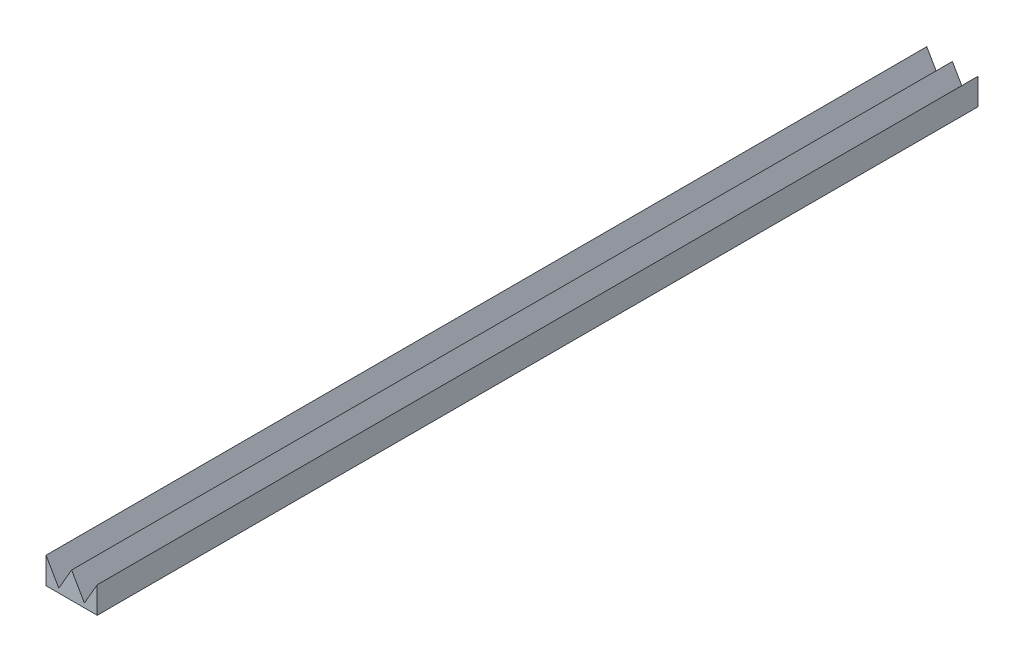
ISO-10303-21;
HEADER;
FILE_DESCRIPTION(('STEP AP214'),'2;1');
FILE_NAME('part.step','',(''),(''),'','','');
FILE_SCHEMA(('AUTOMOTIVE_DESIGN { 1 0 10303 214 1 1 1 1 }'));
ENDSEC;
DATA;
#1=APPLICATION_CONTEXT('core data for automotive mechanical design processes');
#2=APPLICATION_PROTOCOL_DEFINITION('international standard','automotive_design',2000,#1);
#3=PRODUCT_CONTEXT('',#1,'mechanical');
#4=PRODUCT('Part','Part','',(#3));
#5=PRODUCT_RELATED_PRODUCT_CATEGORY('part','',(#4));
#6=PRODUCT_DEFINITION_FORMATION('','',#4);
#7=PRODUCT_DEFINITION_CONTEXT('part definition',#1,'design');
#8=PRODUCT_DEFINITION('design','',#6,#7);
#9=PRODUCT_DEFINITION_SHAPE('','',#8);
#10=(LENGTH_UNIT() NAMED_UNIT(*) SI_UNIT(.MILLI.,.METRE.));
#11=(NAMED_UNIT(*) PLANE_ANGLE_UNIT() SI_UNIT($,.RADIAN.));
#12=(NAMED_UNIT(*) SI_UNIT($,.STERADIAN.) SOLID_ANGLE_UNIT());
#13=UNCERTAINTY_MEASURE_WITH_UNIT(LENGTH_MEASURE(1.E-05),#10,'distance_accuracy_value','');
#14=(GEOMETRIC_REPRESENTATION_CONTEXT(3) GLOBAL_UNCERTAINTY_ASSIGNED_CONTEXT((#13)) GLOBAL_UNIT_ASSIGNED_CONTEXT((#10,
#11,#12)) REPRESENTATION_CONTEXT('',''));
#15=CARTESIAN_POINT('',(0.,0.,0.));
#16=DIRECTION('',(0.,0.,1.));
#17=DIRECTION('',(1.,0.,0.));
#18=AXIS2_PLACEMENT_3D('',#15,#16,#17);
#19=CARTESIAN_POINT('',(10.,0.,172.));
#20=DIRECTION('',(0.,1.,0.));
#21=DIRECTION('',(-1.,0.,0.));
#22=AXIS2_PLACEMENT_3D('',#19,#20,#21);
#23=PLANE('',#22);
#24=DIRECTION('',(1.,0.,0.));
#25=VECTOR('',#24,1.);
#26=CARTESIAN_POINT('',(10.,0.,0.));
#27=LINE('',#26,#25);
#28=CARTESIAN_POINT('',(0.,0.,0.));
#29=VERTEX_POINT('',#28);
#30=CARTESIAN_POINT('',(10.,0.,0.));
#31=VERTEX_POINT('',#30);
#32=EDGE_CURVE('E129',#29,#31,#27,.T.);
#33=ORIENTED_EDGE('',*,*,#32,.T.);
#34=DIRECTION('',(0.,0.,-1.));
#35=VECTOR('',#34,1.);
#36=CARTESIAN_POINT('',(10.,0.,172.));
#37=LINE('',#36,#35);
#38=CARTESIAN_POINT('',(10.,0.,172.));
#39=VERTEX_POINT('',#38);
#40=EDGE_CURVE('E11',#39,#31,#37,.T.);
#41=ORIENTED_EDGE('',*,*,#40,.F.);
#42=DIRECTION('',(1.,0.,0.));
#43=VECTOR('',#42,1.);
#44=CARTESIAN_POINT('',(10.,0.,172.));
#45=LINE('',#44,#43);
#46=CARTESIAN_POINT('',(0.,0.,172.));
#47=VERTEX_POINT('',#46);
#48=EDGE_CURVE('E141',#47,#39,#45,.T.);
#49=ORIENTED_EDGE('',*,*,#48,.F.);
#50=DIRECTION('',(0.,0.,-1.));
#51=VECTOR('',#50,1.);
#52=CARTESIAN_POINT('',(0.,0.,172.));
#53=LINE('',#52,#51);
#54=EDGE_CURVE('E125',#47,#29,#53,.T.);
#55=ORIENTED_EDGE('',*,*,#54,.T.);
#56=EDGE_LOOP('',(#33,#41,#49,#55));
#57=FACE_BOUND('',#56,.T.);
#58=ADVANCED_FACE('F39',(#57),#23,.F.);
#59=CARTESIAN_POINT('',(10.,5.1650635094611,172.));
#60=DIRECTION('',(-1.,0.,0.));
#61=DIRECTION('',(0.,-1.,0.));
#62=AXIS2_PLACEMENT_3D('',#59,#60,#61);
#63=PLANE('',#62);
#64=DIRECTION('',(0.,1.,0.));
#65=VECTOR('',#64,1.);
#66=CARTESIAN_POINT('',(10.,5.1650635094611,0.));
#67=LINE('',#66,#65);
#68=CARTESIAN_POINT('',(10.,5.1650635094611,0.));
#69=VERTEX_POINT('',#68);
#70=EDGE_CURVE('E132',#31,#69,#67,.T.);
#71=ORIENTED_EDGE('',*,*,#70,.T.);
#72=DIRECTION('',(0.,0.,-1.));
#73=VECTOR('',#72,1.);
#74=CARTESIAN_POINT('',(10.,5.1650635094611,172.));
#75=LINE('',#74,#73);
#76=CARTESIAN_POINT('',(10.,5.1650635094611,172.));
#77=VERTEX_POINT('',#76);
#78=EDGE_CURVE('E47',#77,#69,#75,.T.);
#79=ORIENTED_EDGE('',*,*,#78,.F.);
#80=DIRECTION('',(0.,1.,0.));
#81=VECTOR('',#80,1.);
#82=CARTESIAN_POINT('',(10.,5.1650635094611,172.));
#83=LINE('',#82,#81);
#84=EDGE_CURVE('E95',#39,#77,#83,.T.);
#85=ORIENTED_EDGE('',*,*,#84,.F.);
#86=ORIENTED_EDGE('',*,*,#40,.T.);
#87=EDGE_LOOP('',(#71,#79,#85,#86));
#88=FACE_BOUND('',#87,.T.);
#89=ADVANCED_FACE('F166',(#88),#63,.F.);
#90=CARTESIAN_POINT('',(7.5,0.834936490538904,172.));
#91=DIRECTION('',(0.866025403784439,-0.5,0.));
#92=DIRECTION('',(0.5,0.866025403784439,0.));
#93=AXIS2_PLACEMENT_3D('',#90,#91,#92);
#94=PLANE('',#93);
#95=DIRECTION('',(-0.5,-0.866025403784439,0.));
#96=VECTOR('',#95,1.);
#97=CARTESIAN_POINT('',(7.5,0.834936490538904,0.));
#98=LINE('',#97,#96);
#99=CARTESIAN_POINT('',(7.5,0.834936490538904,0.));
#100=VERTEX_POINT('',#99);
#101=EDGE_CURVE('E134',#69,#100,#98,.T.);
#102=ORIENTED_EDGE('',*,*,#101,.T.);
#103=DIRECTION('',(0.,0.,-1.));
#104=VECTOR('',#103,1.);
#105=CARTESIAN_POINT('',(7.5,0.834936490538904,172.));
#106=LINE('',#105,#104);
#107=CARTESIAN_POINT('',(7.5,0.834936490538904,172.));
#108=VERTEX_POINT('',#107);
#109=EDGE_CURVE('E145',#108,#100,#106,.T.);
#110=ORIENTED_EDGE('',*,*,#109,.F.);
#111=DIRECTION('',(-0.5,-0.866025403784439,0.));
#112=VECTOR('',#111,1.);
#113=CARTESIAN_POINT('',(7.5,0.834936490538904,172.));
#114=LINE('',#113,#112);
#115=EDGE_CURVE('E153',#77,#108,#114,.T.);
#116=ORIENTED_EDGE('',*,*,#115,.F.);
#117=ORIENTED_EDGE('',*,*,#78,.T.);
#118=EDGE_LOOP('',(#102,#110,#116,#117));
#119=FACE_BOUND('',#118,.T.);
#120=ADVANCED_FACE('F151',(#119),#94,.F.);
#121=CARTESIAN_POINT('',(5.,5.1650635094611,172.));
#122=DIRECTION('',(-0.866025403784439,-0.5,0.));
#123=DIRECTION('',(0.5,-0.866025403784439,0.));
#124=AXIS2_PLACEMENT_3D('',#121,#122,#123);
#125=PLANE('',#124);
#126=DIRECTION('',(-0.5,0.866025403784438,0.));
#127=VECTOR('',#126,1.);
#128=CARTESIAN_POINT('',(5.,5.1650635094611,0.));
#129=LINE('',#128,#127);
#130=CARTESIAN_POINT('',(5.,5.1650635094611,0.));
#131=VERTEX_POINT('',#130);
#132=EDGE_CURVE('E136',#100,#131,#129,.T.);
#133=ORIENTED_EDGE('',*,*,#132,.T.);
#134=DIRECTION('',(0.,0.,-1.));
#135=VECTOR('',#134,1.);
#136=CARTESIAN_POINT('',(5.,5.1650635094611,172.));
#137=LINE('',#136,#135);
#138=CARTESIAN_POINT('',(5.,5.1650635094611,172.));
#139=VERTEX_POINT('',#138);
#140=EDGE_CURVE('E120',#139,#131,#137,.T.);
#141=ORIENTED_EDGE('',*,*,#140,.F.);
#142=DIRECTION('',(-0.5,0.866025403784438,0.));
#143=VECTOR('',#142,1.);
#144=CARTESIAN_POINT('',(5.,5.1650635094611,172.));
#145=LINE('',#144,#143);
#146=EDGE_CURVE('E111',#108,#139,#145,.T.);
#147=ORIENTED_EDGE('',*,*,#146,.F.);
#148=ORIENTED_EDGE('',*,*,#109,.T.);
#149=EDGE_LOOP('',(#133,#141,#147,#148));
#150=FACE_BOUND('',#149,.T.);
#151=ADVANCED_FACE('F159',(#150),#125,.F.);
#152=CARTESIAN_POINT('',(2.5,0.834936490538904,172.));
#153=DIRECTION('',(0.866025403784439,-0.5,0.));
#154=DIRECTION('',(0.5,0.866025403784439,0.));
#155=AXIS2_PLACEMENT_3D('',#152,#153,#154);
#156=PLANE('',#155);
#157=DIRECTION('',(-0.5,-0.866025403784439,0.));
#158=VECTOR('',#157,1.);
#159=CARTESIAN_POINT('',(2.5,0.834936490538904,0.));
#160=LINE('',#159,#158);
#161=CARTESIAN_POINT('',(2.5,0.834936490538904,0.));
#162=VERTEX_POINT('',#161);
#163=EDGE_CURVE('E119',#131,#162,#160,.T.);
#164=ORIENTED_EDGE('',*,*,#163,.T.);
#165=DIRECTION('',(0.,0.,-1.));
#166=VECTOR('',#165,1.);
#167=CARTESIAN_POINT('',(2.5,0.834936490538904,172.));
#168=LINE('',#167,#166);
#169=CARTESIAN_POINT('',(2.5,0.834936490538904,172.));
#170=VERTEX_POINT('',#169);
#171=EDGE_CURVE('E116',#170,#162,#168,.T.);
#172=ORIENTED_EDGE('',*,*,#171,.F.);
#173=DIRECTION('',(-0.5,-0.866025403784439,0.));
#174=VECTOR('',#173,1.);
#175=CARTESIAN_POINT('',(2.5,0.834936490538904,172.));
#176=LINE('',#175,#174);
#177=EDGE_CURVE('E105',#139,#170,#176,.T.);
#178=ORIENTED_EDGE('',*,*,#177,.F.);
#179=ORIENTED_EDGE('',*,*,#140,.T.);
#180=EDGE_LOOP('',(#164,#172,#178,#179));
#181=FACE_BOUND('',#180,.T.);
#182=ADVANCED_FACE('F117',(#181),#156,.F.);
#183=CARTESIAN_POINT('',(0.,5.1650635094611,172.));
#184=DIRECTION('',(-0.866025403784439,-0.5,0.));
#185=DIRECTION('',(0.5,-0.866025403784439,0.));
#186=AXIS2_PLACEMENT_3D('',#183,#184,#185);
#187=PLANE('',#186);
#188=DIRECTION('',(-0.5,0.866025403784439,0.));
#189=VECTOR('',#188,1.);
#190=CARTESIAN_POINT('',(0.,5.1650635094611,0.));
#191=LINE('',#190,#189);
#192=CARTESIAN_POINT('',(0.,5.1650635094611,0.));
#193=VERTEX_POINT('',#192);
#194=EDGE_CURVE('E81',#162,#193,#191,.T.);
#195=ORIENTED_EDGE('',*,*,#194,.T.);
#196=DIRECTION('',(0.,0.,-1.));
#197=VECTOR('',#196,1.);
#198=CARTESIAN_POINT('',(0.,5.1650635094611,172.));
#199=LINE('',#198,#197);
#200=CARTESIAN_POINT('',(0.,5.1650635094611,172.));
#201=VERTEX_POINT('',#200);
#202=EDGE_CURVE('E121',#201,#193,#199,.T.);
#203=ORIENTED_EDGE('',*,*,#202,.F.);
#204=DIRECTION('',(-0.5,0.866025403784439,0.));
#205=VECTOR('',#204,1.);
#206=CARTESIAN_POINT('',(0.,5.1650635094611,172.));
#207=LINE('',#206,#205);
#208=EDGE_CURVE('E109',#170,#201,#207,.T.);
#209=ORIENTED_EDGE('',*,*,#208,.F.);
#210=ORIENTED_EDGE('',*,*,#171,.T.);
#211=EDGE_LOOP('',(#195,#203,#209,#210));
#212=FACE_BOUND('',#211,.T.);
#213=ADVANCED_FACE('F123',(#212),#187,.F.);
#214=CARTESIAN_POINT('',(0.,0.,172.));
#215=DIRECTION('',(1.,0.,0.));
#216=DIRECTION('',(0.,0.,-1.));
#217=AXIS2_PLACEMENT_3D('',#214,#215,#216);
#218=PLANE('',#217);
#219=DIRECTION('',(0.,-1.,0.));
#220=VECTOR('',#219,1.);
#221=CARTESIAN_POINT('',(0.,0.,0.));
#222=LINE('',#221,#220);
#223=EDGE_CURVE('E87',#193,#29,#222,.T.);
#224=ORIENTED_EDGE('',*,*,#223,.T.);
#225=ORIENTED_EDGE('',*,*,#54,.F.);
#226=DIRECTION('',(0.,-1.,0.));
#227=VECTOR('',#226,1.);
#228=CARTESIAN_POINT('',(0.,0.,172.));
#229=LINE('',#228,#227);
#230=EDGE_CURVE('E55',#201,#47,#229,.T.);
#231=ORIENTED_EDGE('',*,*,#230,.F.);
#232=ORIENTED_EDGE('',*,*,#202,.T.);
#233=EDGE_LOOP('',(#224,#225,#231,#232));
#234=FACE_BOUND('',#233,.T.);
#235=ADVANCED_FACE('F180',(#234),#218,.F.);
#236=CARTESIAN_POINT('',(0.,0.,172.));
#237=DIRECTION('',(0.,0.,-1.));
#238=DIRECTION('',(-1.,0.,0.));
#239=AXIS2_PLACEMENT_3D('',#236,#237,#238);
#240=PLANE('',#239);
#241=ORIENTED_EDGE('',*,*,#48,.T.);
#242=ORIENTED_EDGE('',*,*,#84,.T.);
#243=ORIENTED_EDGE('',*,*,#115,.T.);
#244=ORIENTED_EDGE('',*,*,#146,.T.);
#245=ORIENTED_EDGE('',*,*,#177,.T.);
#246=ORIENTED_EDGE('',*,*,#208,.T.);
#247=ORIENTED_EDGE('',*,*,#230,.T.);
#248=EDGE_LOOP('',(#241,#242,#243,#244,#245,#246,#247));
#249=FACE_BOUND('',#248,.T.);
#250=ADVANCED_FACE('F107',(#249),#240,.F.);
#251=CARTESIAN_POINT('',(0.,0.,0.));
#252=DIRECTION('',(0.,0.,-1.));
#253=DIRECTION('',(-1.,0.,0.));
#254=AXIS2_PLACEMENT_3D('',#251,#252,#253);
#255=PLANE('',#254);
#256=ORIENTED_EDGE('',*,*,#32,.F.);
#257=ORIENTED_EDGE('',*,*,#223,.F.);
#258=ORIENTED_EDGE('',*,*,#194,.F.);
#259=ORIENTED_EDGE('',*,*,#163,.F.);
#260=ORIENTED_EDGE('',*,*,#132,.F.);
#261=ORIENTED_EDGE('',*,*,#101,.F.);
#262=ORIENTED_EDGE('',*,*,#70,.F.);
#263=EDGE_LOOP('',(#256,#257,#258,#259,#260,#261,#262));
#264=FACE_BOUND('',#263,.T.);
#265=ADVANCED_FACE('F157',(#264),#255,.T.);
#266=CLOSED_SHELL('',(#58,#89,#120,#151,#182,#213,#235,#250,#265));
#267=MANIFOLD_SOLID_BREP('B2',#266);
#268=ADVANCED_BREP_SHAPE_REPRESENTATION('',(#18,#267),#14);
#269=SHAPE_DEFINITION_REPRESENTATION(#9,#268);
ENDSEC;
END-ISO-10303-21;
